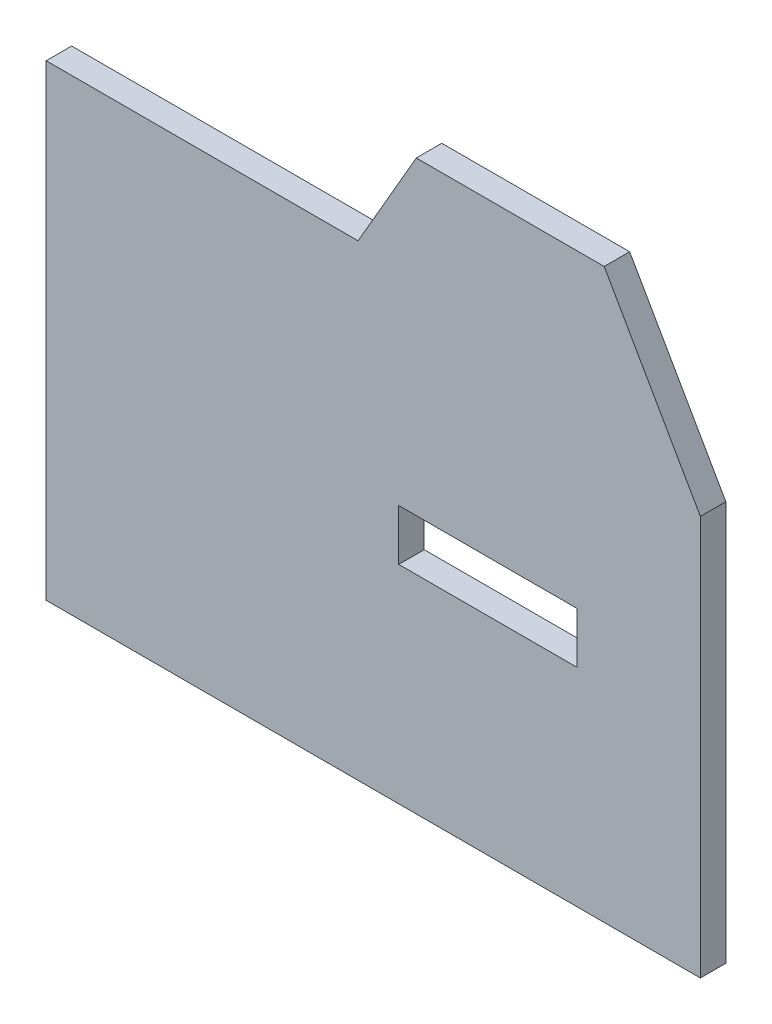
ISO-10303-21;
HEADER;
FILE_DESCRIPTION(('STEP AP214'),'2;1');
FILE_NAME('part.step','',(''),(''),'','','');
FILE_SCHEMA(('AUTOMOTIVE_DESIGN { 1 0 10303 214 1 1 1 1 }'));
ENDSEC;
DATA;
#1=APPLICATION_CONTEXT('core data for automotive mechanical design processes');
#2=APPLICATION_PROTOCOL_DEFINITION('international standard','automotive_design',2000,#1);
#3=PRODUCT_CONTEXT('',#1,'mechanical');
#4=PRODUCT('Part','Part','',(#3));
#5=PRODUCT_RELATED_PRODUCT_CATEGORY('part','',(#4));
#6=PRODUCT_DEFINITION_FORMATION('','',#4);
#7=PRODUCT_DEFINITION_CONTEXT('part definition',#1,'design');
#8=PRODUCT_DEFINITION('design','',#6,#7);
#9=PRODUCT_DEFINITION_SHAPE('','',#8);
#10=(LENGTH_UNIT() NAMED_UNIT(*) SI_UNIT(.MILLI.,.METRE.));
#11=(NAMED_UNIT(*) PLANE_ANGLE_UNIT() SI_UNIT($,.RADIAN.));
#12=(NAMED_UNIT(*) SI_UNIT($,.STERADIAN.) SOLID_ANGLE_UNIT());
#13=UNCERTAINTY_MEASURE_WITH_UNIT(LENGTH_MEASURE(1.E-05),#10,'distance_accuracy_value','');
#14=(GEOMETRIC_REPRESENTATION_CONTEXT(3) GLOBAL_UNCERTAINTY_ASSIGNED_CONTEXT((#13)) GLOBAL_UNIT_ASSIGNED_CONTEXT((#10,
#11,#12)) REPRESENTATION_CONTEXT('',''));
#15=CARTESIAN_POINT('',(0.,0.,0.));
#16=DIRECTION('',(0.,0.,1.));
#17=DIRECTION('',(1.,0.,0.));
#18=AXIS2_PLACEMENT_3D('',#15,#16,#17);
#19=CARTESIAN_POINT('',(78.3220894613165,44.7341186455737,3.));
#20=DIRECTION('',(0.868345141419592,0.495960396980433,0.));
#21=DIRECTION('',(-0.495960396980433,0.868345141419592,0.));
#22=AXIS2_PLACEMENT_3D('',#19,#20,#21);
#23=PLANE('',#22);
#24=DIRECTION('',(0.495960396980433,-0.868345141419592,0.));
#25=VECTOR('',#24,1.);
#26=CARTESIAN_POINT('',(78.3220894613165,44.7341186455737,0.));
#27=LINE('',#26,#25);
#28=CARTESIAN_POINT('',(65.6794,66.86939,0.));
#29=VERTEX_POINT('',#28);
#30=CARTESIAN_POINT('',(77.,47.04888,0.));
#31=VERTEX_POINT('',#30);
#32=EDGE_CURVE('E157',#29,#31,#27,.T.);
#33=ORIENTED_EDGE('',*,*,#32,.F.);
#34=DIRECTION('',(0.,0.,-1.));
#35=VECTOR('',#34,1.);
#36=CARTESIAN_POINT('',(65.6794,66.86939,3.));
#37=LINE('',#36,#35);
#38=CARTESIAN_POINT('',(65.6794,66.86939,3.));
#39=VERTEX_POINT('',#38);
#40=EDGE_CURVE('E11',#39,#29,#37,.T.);
#41=ORIENTED_EDGE('',*,*,#40,.F.);
#42=DIRECTION('',(0.495960396980433,-0.868345141419592,0.));
#43=VECTOR('',#42,1.);
#44=CARTESIAN_POINT('',(78.3220894613165,44.7341186455737,3.));
#45=LINE('',#44,#43);
#46=CARTESIAN_POINT('',(77.,47.04888,3.));
#47=VERTEX_POINT('',#46);
#48=EDGE_CURVE('E158',#39,#47,#45,.T.);
#49=ORIENTED_EDGE('',*,*,#48,.T.);
#50=DIRECTION('',(0.,0.,-1.));
#51=VECTOR('',#50,1.);
#52=CARTESIAN_POINT('',(77.,47.04888,3.));
#53=LINE('',#52,#51);
#54=EDGE_CURVE('E178',#47,#31,#53,.T.);
#55=ORIENTED_EDGE('',*,*,#54,.T.);
#56=EDGE_LOOP('',(#33,#41,#49,#55));
#57=FACE_BOUND('',#56,.T.);
#58=ADVANCED_FACE('F41',(#57),#23,.T.);
#59=CARTESIAN_POINT('',(0.,66.86939,3.));
#60=DIRECTION('',(0.,1.,0.));
#61=DIRECTION('',(0.,0.,1.));
#62=AXIS2_PLACEMENT_3D('',#59,#60,#61);
#63=PLANE('',#62);
#64=DIRECTION('',(1.,0.,0.));
#65=VECTOR('',#64,1.);
#66=CARTESIAN_POINT('',(0.,66.86939,0.));
#67=LINE('',#66,#65);
#68=CARTESIAN_POINT('',(43.56615,66.86939,0.));
#69=VERTEX_POINT('',#68);
#70=EDGE_CURVE('E181',#69,#29,#67,.T.);
#71=ORIENTED_EDGE('',*,*,#70,.F.);
#72=DIRECTION('',(0.,0.,-1.));
#73=VECTOR('',#72,1.);
#74=CARTESIAN_POINT('',(43.56615,66.86939,3.));
#75=LINE('',#74,#73);
#76=CARTESIAN_POINT('',(43.56615,66.86939,3.));
#77=VERTEX_POINT('',#76);
#78=EDGE_CURVE('E48',#77,#69,#75,.T.);
#79=ORIENTED_EDGE('',*,*,#78,.F.);
#80=DIRECTION('',(1.,0.,0.));
#81=VECTOR('',#80,1.);
#82=CARTESIAN_POINT('',(0.,66.86939,3.));
#83=LINE('',#82,#81);
#84=EDGE_CURVE('E161',#77,#39,#83,.T.);
#85=ORIENTED_EDGE('',*,*,#84,.T.);
#86=ORIENTED_EDGE('',*,*,#40,.T.);
#87=EDGE_LOOP('',(#71,#79,#85,#86));
#88=FACE_BOUND('',#87,.T.);
#89=ADVANCED_FACE('F213',(#88),#63,.T.);
#90=CARTESIAN_POINT('',(3.71929707931593,-2.14733857638313,3.));
#91=DIRECTION('',(-0.866025261979014,0.50000024561412,0.));
#92=DIRECTION('',(-0.50000024561412,-0.866025261979014,0.));
#93=AXIS2_PLACEMENT_3D('',#90,#91,#92);
#94=PLANE('',#93);
#95=DIRECTION('',(0.50000024561412,0.866025261979014,0.));
#96=VECTOR('',#95,1.);
#97=CARTESIAN_POINT('',(3.71929707931593,-2.14733857638313,0.));
#98=LINE('',#97,#96);
#99=CARTESIAN_POINT('',(36.71335,55.,0.));
#100=VERTEX_POINT('',#99);
#101=EDGE_CURVE('E184',#100,#69,#98,.T.);
#102=ORIENTED_EDGE('',*,*,#101,.F.);
#103=DIRECTION('',(0.,0.,-1.));
#104=VECTOR('',#103,1.);
#105=CARTESIAN_POINT('',(36.71335,55.,3.));
#106=LINE('',#105,#104);
#107=CARTESIAN_POINT('',(36.71335,55.,3.));
#108=VERTEX_POINT('',#107);
#109=EDGE_CURVE('E205',#108,#100,#106,.T.);
#110=ORIENTED_EDGE('',*,*,#109,.F.);
#111=DIRECTION('',(0.50000024561412,0.866025261979014,0.));
#112=VECTOR('',#111,1.);
#113=CARTESIAN_POINT('',(3.71929707931593,-2.14733857638313,3.));
#114=LINE('',#113,#112);
#115=EDGE_CURVE('E165',#108,#77,#114,.T.);
#116=ORIENTED_EDGE('',*,*,#115,.T.);
#117=ORIENTED_EDGE('',*,*,#78,.T.);
#118=EDGE_LOOP('',(#102,#110,#116,#117));
#119=FACE_BOUND('',#118,.T.);
#120=ADVANCED_FACE('F209',(#119),#94,.T.);
#121=CARTESIAN_POINT('',(0.,55.,3.));
#122=DIRECTION('',(0.,1.,0.));
#123=DIRECTION('',(0.,0.,1.));
#124=AXIS2_PLACEMENT_3D('',#121,#122,#123);
#125=PLANE('',#124);
#126=DIRECTION('',(1.,0.,0.));
#127=VECTOR('',#126,1.);
#128=CARTESIAN_POINT('',(0.,55.,0.));
#129=LINE('',#128,#127);
#130=CARTESIAN_POINT('',(0.,55.,0.));
#131=VERTEX_POINT('',#130);
#132=EDGE_CURVE('E187',#131,#100,#129,.T.);
#133=ORIENTED_EDGE('',*,*,#132,.F.);
#134=DIRECTION('',(0.,0.,-1.));
#135=VECTOR('',#134,1.);
#136=CARTESIAN_POINT('',(0.,55.,3.));
#137=LINE('',#136,#135);
#138=CARTESIAN_POINT('',(0.,55.,3.));
#139=VERTEX_POINT('',#138);
#140=EDGE_CURVE('E203',#139,#131,#137,.T.);
#141=ORIENTED_EDGE('',*,*,#140,.F.);
#142=DIRECTION('',(1.,0.,0.));
#143=VECTOR('',#142,1.);
#144=CARTESIAN_POINT('',(0.,55.,3.));
#145=LINE('',#144,#143);
#146=EDGE_CURVE('E168',#139,#108,#145,.T.);
#147=ORIENTED_EDGE('',*,*,#146,.T.);
#148=ORIENTED_EDGE('',*,*,#109,.T.);
#149=EDGE_LOOP('',(#133,#141,#147,#148));
#150=FACE_BOUND('',#149,.T.);
#151=ADVANCED_FACE('F219',(#150),#125,.T.);
#152=CARTESIAN_POINT('',(0.,0.,3.));
#153=DIRECTION('',(-1.,0.,0.));
#154=DIRECTION('',(0.,0.,1.));
#155=AXIS2_PLACEMENT_3D('',#152,#153,#154);
#156=PLANE('',#155);
#157=DIRECTION('',(0.,1.,0.));
#158=VECTOR('',#157,1.);
#159=CARTESIAN_POINT('',(0.,0.,0.));
#160=LINE('',#159,#158);
#161=CARTESIAN_POINT('',(0.,0.,0.));
#162=VERTEX_POINT('',#161);
#163=EDGE_CURVE('E190',#162,#131,#160,.T.);
#164=ORIENTED_EDGE('',*,*,#163,.F.);
#165=DIRECTION('',(0.,0.,-1.));
#166=VECTOR('',#165,1.);
#167=CARTESIAN_POINT('',(0.,0.,3.));
#168=LINE('',#167,#166);
#169=CARTESIAN_POINT('',(0.,0.,3.));
#170=VERTEX_POINT('',#169);
#171=EDGE_CURVE('E201',#170,#162,#168,.T.);
#172=ORIENTED_EDGE('',*,*,#171,.F.);
#173=DIRECTION('',(0.,1.,0.));
#174=VECTOR('',#173,1.);
#175=CARTESIAN_POINT('',(0.,0.,3.));
#176=LINE('',#175,#174);
#177=EDGE_CURVE('E171',#170,#139,#176,.T.);
#178=ORIENTED_EDGE('',*,*,#177,.T.);
#179=ORIENTED_EDGE('',*,*,#140,.T.);
#180=EDGE_LOOP('',(#164,#172,#178,#179));
#181=FACE_BOUND('',#180,.T.);
#182=ADVANCED_FACE('F236',(#181),#156,.T.);
#183=CARTESIAN_POINT('',(0.,0.,3.));
#184=DIRECTION('',(0.,1.,0.));
#185=DIRECTION('',(0.,0.,1.));
#186=AXIS2_PLACEMENT_3D('',#183,#184,#185);
#187=PLANE('',#186);
#188=DIRECTION('',(1.,0.,0.));
#189=VECTOR('',#188,1.);
#190=CARTESIAN_POINT('',(0.,0.,0.));
#191=LINE('',#190,#189);
#192=CARTESIAN_POINT('',(77.,0.,0.));
#193=VERTEX_POINT('',#192);
#194=EDGE_CURVE('E193',#162,#193,#191,.T.);
#195=ORIENTED_EDGE('',*,*,#194,.T.);
#196=DIRECTION('',(0.,0.,-1.));
#197=VECTOR('',#196,1.);
#198=CARTESIAN_POINT('',(77.,0.,3.));
#199=LINE('',#198,#197);
#200=CARTESIAN_POINT('',(77.,0.,3.));
#201=VERTEX_POINT('',#200);
#202=EDGE_CURVE('E198',#201,#193,#199,.T.);
#203=ORIENTED_EDGE('',*,*,#202,.F.);
#204=DIRECTION('',(1.,0.,0.));
#205=VECTOR('',#204,1.);
#206=CARTESIAN_POINT('',(0.,0.,3.));
#207=LINE('',#206,#205);
#208=EDGE_CURVE('E174',#170,#201,#207,.T.);
#209=ORIENTED_EDGE('',*,*,#208,.F.);
#210=ORIENTED_EDGE('',*,*,#171,.T.);
#211=EDGE_LOOP('',(#195,#203,#209,#210));
#212=FACE_BOUND('',#211,.T.);
#213=ADVANCED_FACE('F234',(#212),#187,.F.);
#214=CARTESIAN_POINT('',(77.,0.,3.));
#215=DIRECTION('',(-1.,0.,0.));
#216=DIRECTION('',(0.,0.,1.));
#217=AXIS2_PLACEMENT_3D('',#214,#215,#216);
#218=PLANE('',#217);
#219=DIRECTION('',(0.,1.,0.));
#220=VECTOR('',#219,1.);
#221=CARTESIAN_POINT('',(77.,0.,0.));
#222=LINE('',#221,#220);
#223=EDGE_CURVE('E162',#193,#31,#222,.T.);
#224=ORIENTED_EDGE('',*,*,#223,.T.);
#225=ORIENTED_EDGE('',*,*,#54,.F.);
#226=DIRECTION('',(0.,1.,0.));
#227=VECTOR('',#226,1.);
#228=CARTESIAN_POINT('',(77.,0.,3.));
#229=LINE('',#228,#227);
#230=EDGE_CURVE('E176',#201,#47,#229,.T.);
#231=ORIENTED_EDGE('',*,*,#230,.F.);
#232=ORIENTED_EDGE('',*,*,#202,.T.);
#233=EDGE_LOOP('',(#224,#225,#231,#232));
#234=FACE_BOUND('',#233,.T.);
#235=ADVANCED_FACE('F230',(#234),#218,.F.);
#236=CARTESIAN_POINT('',(0.,0.,3.));
#237=DIRECTION('',(0.,0.,1.));
#238=DIRECTION('',(1.,0.,0.));
#239=AXIS2_PLACEMENT_3D('',#236,#237,#238);
#240=PLANE('',#239);
#241=DIRECTION('',(0.,1.,0.));
#242=VECTOR('',#241,1.);
#243=CARTESIAN_POINT('',(62.5,0.,3.));
#244=LINE('',#243,#242);
#245=CARTESIAN_POINT('',(62.5,24.41,3.));
#246=VERTEX_POINT('',#245);
#247=CARTESIAN_POINT('',(62.5,30.41,3.));
#248=VERTEX_POINT('',#247);
#249=EDGE_CURVE('E155',#246,#248,#244,.T.);
#250=ORIENTED_EDGE('',*,*,#249,.F.);
#251=DIRECTION('',(1.,0.,0.));
#252=VECTOR('',#251,1.);
#253=CARTESIAN_POINT('',(0.,24.41,3.));
#254=LINE('',#253,#252);
#255=CARTESIAN_POINT('',(41.5,24.41,3.));
#256=VERTEX_POINT('',#255);
#257=EDGE_CURVE('E148',#256,#246,#254,.T.);
#258=ORIENTED_EDGE('',*,*,#257,.F.);
#259=DIRECTION('',(0.,-1.,0.));
#260=VECTOR('',#259,1.);
#261=CARTESIAN_POINT('',(41.5,0.,3.));
#262=LINE('',#261,#260);
#263=CARTESIAN_POINT('',(41.5,30.41,3.));
#264=VERTEX_POINT('',#263);
#265=EDGE_CURVE('E128',#264,#256,#262,.T.);
#266=ORIENTED_EDGE('',*,*,#265,.F.);
#267=DIRECTION('',(-1.,0.,0.));
#268=VECTOR('',#267,1.);
#269=CARTESIAN_POINT('',(0.,30.41,3.));
#270=LINE('',#269,#268);
#271=EDGE_CURVE('E153',#248,#264,#270,.T.);
#272=ORIENTED_EDGE('',*,*,#271,.F.);
#273=EDGE_LOOP('',(#250,#258,#266,#272));
#274=FACE_BOUND('',#273,.T.);
#275=ORIENTED_EDGE('',*,*,#48,.F.);
#276=ORIENTED_EDGE('',*,*,#84,.F.);
#277=ORIENTED_EDGE('',*,*,#115,.F.);
#278=ORIENTED_EDGE('',*,*,#146,.F.);
#279=ORIENTED_EDGE('',*,*,#177,.F.);
#280=ORIENTED_EDGE('',*,*,#208,.T.);
#281=ORIENTED_EDGE('',*,*,#230,.T.);
#282=EDGE_LOOP('',(#275,#276,#277,#278,#279,#280,#281));
#283=FACE_BOUND('',#282,.T.);
#284=ADVANCED_FACE('F223',(#274,#283),#240,.T.);
#285=CARTESIAN_POINT('',(0.,0.,0.));
#286=DIRECTION('',(0.,0.,1.));
#287=DIRECTION('',(1.,0.,0.));
#288=AXIS2_PLACEMENT_3D('',#285,#286,#287);
#289=PLANE('',#288);
#290=DIRECTION('',(-1.,0.,0.));
#291=VECTOR('',#290,1.);
#292=CARTESIAN_POINT('',(62.5,24.41,0.));
#293=LINE('',#292,#291);
#294=CARTESIAN_POINT('',(62.5,24.41,0.));
#295=VERTEX_POINT('',#294);
#296=CARTESIAN_POINT('',(41.5,24.41,0.));
#297=VERTEX_POINT('',#296);
#298=EDGE_CURVE('E134',#295,#297,#293,.T.);
#299=ORIENTED_EDGE('',*,*,#298,.F.);
#300=DIRECTION('',(0.,-1.,0.));
#301=VECTOR('',#300,1.);
#302=CARTESIAN_POINT('',(62.5,24.41,0.));
#303=LINE('',#302,#301);
#304=CARTESIAN_POINT('',(62.5,30.41,0.));
#305=VERTEX_POINT('',#304);
#306=EDGE_CURVE('E63',#305,#295,#303,.T.);
#307=ORIENTED_EDGE('',*,*,#306,.F.);
#308=DIRECTION('',(1.,0.,0.));
#309=VECTOR('',#308,1.);
#310=CARTESIAN_POINT('',(62.5,30.41,0.));
#311=LINE('',#310,#309);
#312=CARTESIAN_POINT('',(41.5,30.41,0.));
#313=VERTEX_POINT('',#312);
#314=EDGE_CURVE('E141',#313,#305,#311,.T.);
#315=ORIENTED_EDGE('',*,*,#314,.F.);
#316=DIRECTION('',(0.,1.,0.));
#317=VECTOR('',#316,1.);
#318=CARTESIAN_POINT('',(41.5,24.41,0.));
#319=LINE('',#318,#317);
#320=EDGE_CURVE('E125',#297,#313,#319,.T.);
#321=ORIENTED_EDGE('',*,*,#320,.F.);
#322=EDGE_LOOP('',(#299,#307,#315,#321));
#323=FACE_BOUND('',#322,.T.);
#324=ORIENTED_EDGE('',*,*,#32,.T.);
#325=ORIENTED_EDGE('',*,*,#223,.F.);
#326=ORIENTED_EDGE('',*,*,#194,.F.);
#327=ORIENTED_EDGE('',*,*,#163,.T.);
#328=ORIENTED_EDGE('',*,*,#132,.T.);
#329=ORIENTED_EDGE('',*,*,#101,.T.);
#330=ORIENTED_EDGE('',*,*,#70,.T.);
#331=EDGE_LOOP('',(#324,#325,#326,#327,#328,#329,#330));
#332=FACE_BOUND('',#331,.T.);
#333=ADVANCED_FACE('F138',(#323,#332),#289,.F.);
#334=CARTESIAN_POINT('',(62.5,24.41,10.));
#335=DIRECTION('',(1.,0.,0.));
#336=DIRECTION('',(0.,0.,-1.));
#337=AXIS2_PLACEMENT_3D('',#334,#335,#336);
#338=PLANE('',#337);
#339=ORIENTED_EDGE('',*,*,#249,.T.);
#340=DIRECTION('',(0.,0.,-1.));
#341=VECTOR('',#340,1.);
#342=CARTESIAN_POINT('',(62.5,30.41,10.));
#343=LINE('',#342,#341);
#344=EDGE_CURVE('E146',#248,#305,#343,.T.);
#345=ORIENTED_EDGE('',*,*,#344,.T.);
#346=ORIENTED_EDGE('',*,*,#306,.T.);
#347=DIRECTION('',(0.,0.,-1.));
#348=VECTOR('',#347,1.);
#349=CARTESIAN_POINT('',(62.5,24.41,10.));
#350=LINE('',#349,#348);
#351=EDGE_CURVE('E131',#246,#295,#350,.T.);
#352=ORIENTED_EDGE('',*,*,#351,.F.);
#353=EDGE_LOOP('',(#339,#345,#346,#352));
#354=FACE_BOUND('',#353,.T.);
#355=ADVANCED_FACE('F297',(#354),#338,.F.);
#356=CARTESIAN_POINT('',(62.5,30.41,10.));
#357=DIRECTION('',(0.,1.,0.));
#358=DIRECTION('',(-1.,0.,0.));
#359=AXIS2_PLACEMENT_3D('',#356,#357,#358);
#360=PLANE('',#359);
#361=ORIENTED_EDGE('',*,*,#271,.T.);
#362=DIRECTION('',(0.,0.,-1.));
#363=VECTOR('',#362,1.);
#364=CARTESIAN_POINT('',(41.5,30.41,10.));
#365=LINE('',#364,#363);
#366=EDGE_CURVE('E130',#264,#313,#365,.T.);
#367=ORIENTED_EDGE('',*,*,#366,.T.);
#368=ORIENTED_EDGE('',*,*,#314,.T.);
#369=ORIENTED_EDGE('',*,*,#344,.F.);
#370=EDGE_LOOP('',(#361,#367,#368,#369));
#371=FACE_BOUND('',#370,.T.);
#372=ADVANCED_FACE('F306',(#371),#360,.F.);
#373=CARTESIAN_POINT('',(41.5,24.41,10.));
#374=DIRECTION('',(-1.,0.,0.));
#375=DIRECTION('',(0.,0.,1.));
#376=AXIS2_PLACEMENT_3D('',#373,#374,#375);
#377=PLANE('',#376);
#378=ORIENTED_EDGE('',*,*,#265,.T.);
#379=DIRECTION('',(0.,0.,-1.));
#380=VECTOR('',#379,1.);
#381=CARTESIAN_POINT('',(41.5,24.41,10.));
#382=LINE('',#381,#380);
#383=EDGE_CURVE('E55',#256,#297,#382,.T.);
#384=ORIENTED_EDGE('',*,*,#383,.T.);
#385=ORIENTED_EDGE('',*,*,#320,.T.);
#386=ORIENTED_EDGE('',*,*,#366,.F.);
#387=EDGE_LOOP('',(#378,#384,#385,#386));
#388=FACE_BOUND('',#387,.T.);
#389=ADVANCED_FACE('F122',(#388),#377,.F.);
#390=CARTESIAN_POINT('',(62.5,24.41,10.));
#391=DIRECTION('',(0.,-1.,0.));
#392=DIRECTION('',(1.,0.,0.));
#393=AXIS2_PLACEMENT_3D('',#390,#391,#392);
#394=PLANE('',#393);
#395=ORIENTED_EDGE('',*,*,#257,.T.);
#396=ORIENTED_EDGE('',*,*,#351,.T.);
#397=ORIENTED_EDGE('',*,*,#298,.T.);
#398=ORIENTED_EDGE('',*,*,#383,.F.);
#399=EDGE_LOOP('',(#395,#396,#397,#398));
#400=FACE_BOUND('',#399,.T.);
#401=ADVANCED_FACE('F135',(#400),#394,.F.);
#402=CLOSED_SHELL('',(#58,#89,#120,#151,#182,#213,#235,#284,#333,#355,#372,#389,#401));
#403=MANIFOLD_SOLID_BREP('B2',#402);
#404=ADVANCED_BREP_SHAPE_REPRESENTATION('',(#18,#403),#14);
#405=SHAPE_DEFINITION_REPRESENTATION(#9,#404);
ENDSEC;
END-ISO-10303-21;
